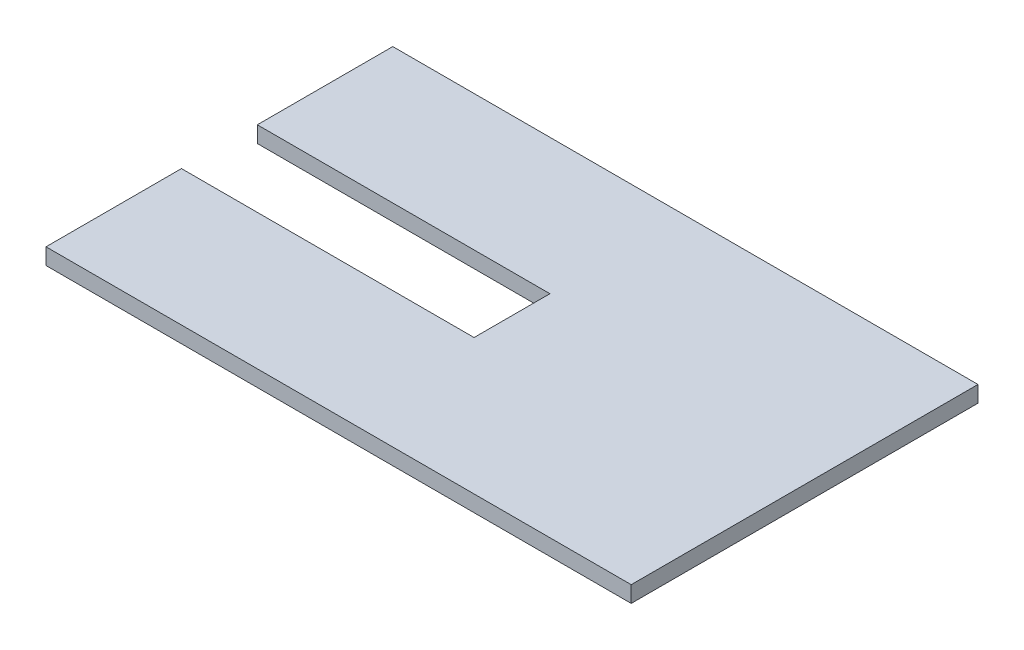
ISO-10303-21;
HEADER;
FILE_DESCRIPTION(('STEP AP214'),'2;1');
FILE_NAME('part.step','',(''),(''),'','','');
FILE_SCHEMA(('AUTOMOTIVE_DESIGN { 1 0 10303 214 1 1 1 1 }'));
ENDSEC;
DATA;
#1=APPLICATION_CONTEXT('core data for automotive mechanical design processes');
#2=APPLICATION_PROTOCOL_DEFINITION('international standard','automotive_design',2000,#1);
#3=PRODUCT_CONTEXT('',#1,'mechanical');
#4=PRODUCT('Part','Part','',(#3));
#5=PRODUCT_RELATED_PRODUCT_CATEGORY('part','',(#4));
#6=PRODUCT_DEFINITION_FORMATION('','',#4);
#7=PRODUCT_DEFINITION_CONTEXT('part definition',#1,'design');
#8=PRODUCT_DEFINITION('design','',#6,#7);
#9=PRODUCT_DEFINITION_SHAPE('','',#8);
#10=(LENGTH_UNIT() NAMED_UNIT(*) SI_UNIT(.MILLI.,.METRE.));
#11=(NAMED_UNIT(*) PLANE_ANGLE_UNIT() SI_UNIT($,.RADIAN.));
#12=(NAMED_UNIT(*) SI_UNIT($,.STERADIAN.) SOLID_ANGLE_UNIT());
#13=UNCERTAINTY_MEASURE_WITH_UNIT(LENGTH_MEASURE(1.E-05),#10,'distance_accuracy_value','');
#14=(GEOMETRIC_REPRESENTATION_CONTEXT(3) GLOBAL_UNCERTAINTY_ASSIGNED_CONTEXT((#13)) GLOBAL_UNIT_ASSIGNED_CONTEXT((#10,
#11,#12)) REPRESENTATION_CONTEXT('',''));
#15=CARTESIAN_POINT('',(0.,0.,0.));
#16=DIRECTION('',(0.,0.,1.));
#17=DIRECTION('',(1.,0.,0.));
#18=AXIS2_PLACEMENT_3D('',#15,#16,#17);
#19=CARTESIAN_POINT('',(54.,3.,32.));
#20=DIRECTION('',(-1.,0.,0.));
#21=DIRECTION('',(0.,0.,1.));
#22=AXIS2_PLACEMENT_3D('',#19,#20,#21);
#23=PLANE('',#22);
#24=DIRECTION('',(0.,0.,-1.));
#25=VECTOR('',#24,1.);
#26=CARTESIAN_POINT('',(54.,0.,32.));
#27=LINE('',#26,#25);
#28=CARTESIAN_POINT('',(54.,0.,32.));
#29=VERTEX_POINT('',#28);
#30=CARTESIAN_POINT('',(54.,0.,-32.));
#31=VERTEX_POINT('',#30);
#32=EDGE_CURVE('E140',#29,#31,#27,.T.);
#33=ORIENTED_EDGE('',*,*,#32,.T.);
#34=DIRECTION('',(0.,-1.,0.));
#35=VECTOR('',#34,1.);
#36=CARTESIAN_POINT('',(54.,3.,-32.));
#37=LINE('',#36,#35);
#38=CARTESIAN_POINT('',(54.,3.,-32.));
#39=VERTEX_POINT('',#38);
#40=EDGE_CURVE('E11',#39,#31,#37,.T.);
#41=ORIENTED_EDGE('',*,*,#40,.F.);
#42=DIRECTION('',(0.,0.,-1.));
#43=VECTOR('',#42,1.);
#44=CARTESIAN_POINT('',(54.,3.,32.));
#45=LINE('',#44,#43);
#46=CARTESIAN_POINT('',(54.,3.,32.));
#47=VERTEX_POINT('',#46);
#48=EDGE_CURVE('E162',#47,#39,#45,.T.);
#49=ORIENTED_EDGE('',*,*,#48,.F.);
#50=DIRECTION('',(0.,-1.,0.));
#51=VECTOR('',#50,1.);
#52=CARTESIAN_POINT('',(54.,3.,32.));
#53=LINE('',#52,#51);
#54=EDGE_CURVE('E136',#47,#29,#53,.T.);
#55=ORIENTED_EDGE('',*,*,#54,.T.);
#56=EDGE_LOOP('',(#33,#41,#49,#55));
#57=FACE_BOUND('',#56,.T.);
#58=ADVANCED_FACE('F39',(#57),#23,.F.);
#59=CARTESIAN_POINT('',(-54.,3.,-32.));
#60=DIRECTION('',(0.,0.,1.));
#61=DIRECTION('',(1.,0.,0.));
#62=AXIS2_PLACEMENT_3D('',#59,#60,#61);
#63=PLANE('',#62);
#64=DIRECTION('',(-1.,0.,0.));
#65=VECTOR('',#64,1.);
#66=CARTESIAN_POINT('',(-54.,0.,-32.));
#67=LINE('',#66,#65);
#68=CARTESIAN_POINT('',(-54.,0.,-32.));
#69=VERTEX_POINT('',#68);
#70=EDGE_CURVE('E144',#31,#69,#67,.T.);
#71=ORIENTED_EDGE('',*,*,#70,.T.);
#72=DIRECTION('',(0.,-1.,0.));
#73=VECTOR('',#72,1.);
#74=CARTESIAN_POINT('',(-54.,3.,-32.));
#75=LINE('',#74,#73);
#76=CARTESIAN_POINT('',(-54.,3.,-32.));
#77=VERTEX_POINT('',#76);
#78=EDGE_CURVE('E48',#77,#69,#75,.T.);
#79=ORIENTED_EDGE('',*,*,#78,.F.);
#80=DIRECTION('',(-1.,0.,0.));
#81=VECTOR('',#80,1.);
#82=CARTESIAN_POINT('',(-54.,3.,-32.));
#83=LINE('',#82,#81);
#84=EDGE_CURVE('E99',#39,#77,#83,.T.);
#85=ORIENTED_EDGE('',*,*,#84,.F.);
#86=ORIENTED_EDGE('',*,*,#40,.T.);
#87=EDGE_LOOP('',(#71,#79,#85,#86));
#88=FACE_BOUND('',#87,.T.);
#89=ADVANCED_FACE('F208',(#88),#63,.F.);
#90=CARTESIAN_POINT('',(-54.,3.,-7.));
#91=DIRECTION('',(1.,0.,0.));
#92=DIRECTION('',(0.,0.,-1.));
#93=AXIS2_PLACEMENT_3D('',#90,#91,#92);
#94=PLANE('',#93);
#95=DIRECTION('',(0.,0.,1.));
#96=VECTOR('',#95,1.);
#97=CARTESIAN_POINT('',(-54.,0.,-7.));
#98=LINE('',#97,#96);
#99=CARTESIAN_POINT('',(-54.,0.,-7.));
#100=VERTEX_POINT('',#99);
#101=EDGE_CURVE('E147',#69,#100,#98,.T.);
#102=ORIENTED_EDGE('',*,*,#101,.T.);
#103=DIRECTION('',(0.,-1.,0.));
#104=VECTOR('',#103,1.);
#105=CARTESIAN_POINT('',(-54.,3.,-7.));
#106=LINE('',#105,#104);
#107=CARTESIAN_POINT('',(-54.,3.,-7.));
#108=VERTEX_POINT('',#107);
#109=EDGE_CURVE('E173',#108,#100,#106,.T.);
#110=ORIENTED_EDGE('',*,*,#109,.F.);
#111=DIRECTION('',(0.,0.,1.));
#112=VECTOR('',#111,1.);
#113=CARTESIAN_POINT('',(-54.,3.,-7.));
#114=LINE('',#113,#112);
#115=EDGE_CURVE('E183',#77,#108,#114,.T.);
#116=ORIENTED_EDGE('',*,*,#115,.F.);
#117=ORIENTED_EDGE('',*,*,#78,.T.);
#118=EDGE_LOOP('',(#102,#110,#116,#117));
#119=FACE_BOUND('',#118,.T.);
#120=ADVANCED_FACE('F181',(#119),#94,.F.);
#121=CARTESIAN_POINT('',(-54.,3.,-7.));
#122=DIRECTION('',(0.,0.,-1.));
#123=DIRECTION('',(-1.,0.,0.));
#124=AXIS2_PLACEMENT_3D('',#121,#122,#123);
#125=PLANE('',#124);
#126=DIRECTION('',(1.,0.,0.));
#127=VECTOR('',#126,1.);
#128=CARTESIAN_POINT('',(-54.,0.,-7.));
#129=LINE('',#128,#127);
#130=CARTESIAN_POINT('',(0.,0.,-7.));
#131=VERTEX_POINT('',#130);
#132=EDGE_CURVE('E150',#100,#131,#129,.T.);
#133=ORIENTED_EDGE('',*,*,#132,.T.);
#134=DIRECTION('',(0.,-1.,0.));
#135=VECTOR('',#134,1.);
#136=CARTESIAN_POINT('',(0.,3.,-7.));
#137=LINE('',#136,#135);
#138=CARTESIAN_POINT('',(0.,3.,-7.));
#139=VERTEX_POINT('',#138);
#140=EDGE_CURVE('E169',#139,#131,#137,.T.);
#141=ORIENTED_EDGE('',*,*,#140,.F.);
#142=DIRECTION('',(1.,0.,0.));
#143=VECTOR('',#142,1.);
#144=CARTESIAN_POINT('',(-54.,3.,-7.));
#145=LINE('',#144,#143);
#146=EDGE_CURVE('E196',#108,#139,#145,.T.);
#147=ORIENTED_EDGE('',*,*,#146,.F.);
#148=ORIENTED_EDGE('',*,*,#109,.T.);
#149=EDGE_LOOP('',(#133,#141,#147,#148));
#150=FACE_BOUND('',#149,.T.);
#151=ADVANCED_FACE('F191',(#150),#125,.F.);
#152=CARTESIAN_POINT('',(0.,3.,-7.));
#153=DIRECTION('',(1.,0.,0.));
#154=DIRECTION('',(0.,0.,-1.));
#155=AXIS2_PLACEMENT_3D('',#152,#153,#154);
#156=PLANE('',#155);
#157=DIRECTION('',(0.,0.,1.));
#158=VECTOR('',#157,1.);
#159=CARTESIAN_POINT('',(0.,0.,-7.));
#160=LINE('',#159,#158);
#161=CARTESIAN_POINT('',(0.,0.,7.));
#162=VERTEX_POINT('',#161);
#163=EDGE_CURVE('E153',#131,#162,#160,.T.);
#164=ORIENTED_EDGE('',*,*,#163,.T.);
#165=DIRECTION('',(0.,-1.,0.));
#166=VECTOR('',#165,1.);
#167=CARTESIAN_POINT('',(0.,3.,7.));
#168=LINE('',#167,#166);
#169=CARTESIAN_POINT('',(0.,3.,7.));
#170=VERTEX_POINT('',#169);
#171=EDGE_CURVE('E129',#170,#162,#168,.T.);
#172=ORIENTED_EDGE('',*,*,#171,.F.);
#173=DIRECTION('',(0.,0.,1.));
#174=VECTOR('',#173,1.);
#175=CARTESIAN_POINT('',(0.,3.,-7.));
#176=LINE('',#175,#174);
#177=EDGE_CURVE('E118',#139,#170,#176,.T.);
#178=ORIENTED_EDGE('',*,*,#177,.F.);
#179=ORIENTED_EDGE('',*,*,#140,.T.);
#180=EDGE_LOOP('',(#164,#172,#178,#179));
#181=FACE_BOUND('',#180,.T.);
#182=ADVANCED_FACE('F194',(#181),#156,.F.);
#183=CARTESIAN_POINT('',(-54.,3.,7.));
#184=DIRECTION('',(0.,0.,1.));
#185=DIRECTION('',(1.,0.,0.));
#186=AXIS2_PLACEMENT_3D('',#183,#184,#185);
#187=PLANE('',#186);
#188=DIRECTION('',(-1.,0.,0.));
#189=VECTOR('',#188,1.);
#190=CARTESIAN_POINT('',(-54.,0.,7.));
#191=LINE('',#190,#189);
#192=CARTESIAN_POINT('',(-54.,0.,7.));
#193=VERTEX_POINT('',#192);
#194=EDGE_CURVE('E127',#162,#193,#191,.T.);
#195=ORIENTED_EDGE('',*,*,#194,.T.);
#196=DIRECTION('',(0.,-1.,0.));
#197=VECTOR('',#196,1.);
#198=CARTESIAN_POINT('',(-54.,3.,7.));
#199=LINE('',#198,#197);
#200=CARTESIAN_POINT('',(-54.,3.,7.));
#201=VERTEX_POINT('',#200);
#202=EDGE_CURVE('E124',#201,#193,#199,.T.);
#203=ORIENTED_EDGE('',*,*,#202,.F.);
#204=DIRECTION('',(-1.,0.,0.));
#205=VECTOR('',#204,1.);
#206=CARTESIAN_POINT('',(-54.,3.,7.));
#207=LINE('',#206,#205);
#208=EDGE_CURVE('E112',#170,#201,#207,.T.);
#209=ORIENTED_EDGE('',*,*,#208,.F.);
#210=ORIENTED_EDGE('',*,*,#171,.T.);
#211=EDGE_LOOP('',(#195,#203,#209,#210));
#212=FACE_BOUND('',#211,.T.);
#213=ADVANCED_FACE('F125',(#212),#187,.F.);
#214=CARTESIAN_POINT('',(-54.,3.,32.));
#215=DIRECTION('',(1.,0.,0.));
#216=DIRECTION('',(0.,0.,-1.));
#217=AXIS2_PLACEMENT_3D('',#214,#215,#216);
#218=PLANE('',#217);
#219=DIRECTION('',(0.,0.,1.));
#220=VECTOR('',#219,1.);
#221=CARTESIAN_POINT('',(-54.,0.,32.));
#222=LINE('',#221,#220);
#223=CARTESIAN_POINT('',(-54.,0.,32.));
#224=VERTEX_POINT('',#223);
#225=EDGE_CURVE('E85',#193,#224,#222,.T.);
#226=ORIENTED_EDGE('',*,*,#225,.T.);
#227=DIRECTION('',(0.,-1.,0.));
#228=VECTOR('',#227,1.);
#229=CARTESIAN_POINT('',(-54.,3.,32.));
#230=LINE('',#229,#228);
#231=CARTESIAN_POINT('',(-54.,3.,32.));
#232=VERTEX_POINT('',#231);
#233=EDGE_CURVE('E130',#232,#224,#230,.T.);
#234=ORIENTED_EDGE('',*,*,#233,.F.);
#235=DIRECTION('',(0.,0.,1.));
#236=VECTOR('',#235,1.);
#237=CARTESIAN_POINT('',(-54.,3.,32.));
#238=LINE('',#237,#236);
#239=EDGE_CURVE('E116',#201,#232,#238,.T.);
#240=ORIENTED_EDGE('',*,*,#239,.F.);
#241=ORIENTED_EDGE('',*,*,#202,.T.);
#242=EDGE_LOOP('',(#226,#234,#240,#241));
#243=FACE_BOUND('',#242,.T.);
#244=ADVANCED_FACE('F132',(#243),#218,.F.);
#245=CARTESIAN_POINT('',(-54.,3.,32.));
#246=DIRECTION('',(0.,0.,-1.));
#247=DIRECTION('',(-1.,0.,0.));
#248=AXIS2_PLACEMENT_3D('',#245,#246,#247);
#249=PLANE('',#248);
#250=DIRECTION('',(1.,0.,0.));
#251=VECTOR('',#250,1.);
#252=CARTESIAN_POINT('',(-54.,0.,32.));
#253=LINE('',#252,#251);
#254=EDGE_CURVE('E91',#224,#29,#253,.T.);
#255=ORIENTED_EDGE('',*,*,#254,.T.);
#256=ORIENTED_EDGE('',*,*,#54,.F.);
#257=DIRECTION('',(1.,0.,0.));
#258=VECTOR('',#257,1.);
#259=CARTESIAN_POINT('',(-54.,3.,32.));
#260=LINE('',#259,#258);
#261=EDGE_CURVE('E56',#232,#47,#260,.T.);
#262=ORIENTED_EDGE('',*,*,#261,.F.);
#263=ORIENTED_EDGE('',*,*,#233,.T.);
#264=EDGE_LOOP('',(#255,#256,#262,#263));
#265=FACE_BOUND('',#264,.T.);
#266=ADVANCED_FACE('F224',(#265),#249,.F.);
#267=CARTESIAN_POINT('',(0.,3.,0.));
#268=DIRECTION('',(0.,-1.,0.));
#269=DIRECTION('',(0.,0.,-1.));
#270=AXIS2_PLACEMENT_3D('',#267,#268,#269);
#271=PLANE('',#270);
#272=ORIENTED_EDGE('',*,*,#48,.T.);
#273=ORIENTED_EDGE('',*,*,#84,.T.);
#274=ORIENTED_EDGE('',*,*,#115,.T.);
#275=ORIENTED_EDGE('',*,*,#146,.T.);
#276=ORIENTED_EDGE('',*,*,#177,.T.);
#277=ORIENTED_EDGE('',*,*,#208,.T.);
#278=ORIENTED_EDGE('',*,*,#239,.T.);
#279=ORIENTED_EDGE('',*,*,#261,.T.);
#280=EDGE_LOOP('',(#272,#273,#274,#275,#276,#277,#278,#279));
#281=FACE_BOUND('',#280,.T.);
#282=ADVANCED_FACE('F114',(#281),#271,.F.);
#283=CARTESIAN_POINT('',(0.,0.,0.));
#284=DIRECTION('',(0.,-1.,0.));
#285=DIRECTION('',(0.,0.,-1.));
#286=AXIS2_PLACEMENT_3D('',#283,#284,#285);
#287=PLANE('',#286);
#288=ORIENTED_EDGE('',*,*,#32,.F.);
#289=ORIENTED_EDGE('',*,*,#254,.F.);
#290=ORIENTED_EDGE('',*,*,#225,.F.);
#291=ORIENTED_EDGE('',*,*,#194,.F.);
#292=ORIENTED_EDGE('',*,*,#163,.F.);
#293=ORIENTED_EDGE('',*,*,#132,.F.);
#294=ORIENTED_EDGE('',*,*,#101,.F.);
#295=ORIENTED_EDGE('',*,*,#70,.F.);
#296=EDGE_LOOP('',(#288,#289,#290,#291,#292,#293,#294,#295));
#297=FACE_BOUND('',#296,.T.);
#298=ADVANCED_FACE('F187',(#297),#287,.T.);
#299=CLOSED_SHELL('',(#58,#89,#120,#151,#182,#213,#244,#266,#282,#298));
#300=MANIFOLD_SOLID_BREP('B2',#299);
#301=ADVANCED_BREP_SHAPE_REPRESENTATION('',(#18,#300),#14);
#302=SHAPE_DEFINITION_REPRESENTATION(#9,#301);
ENDSEC;
END-ISO-10303-21;
